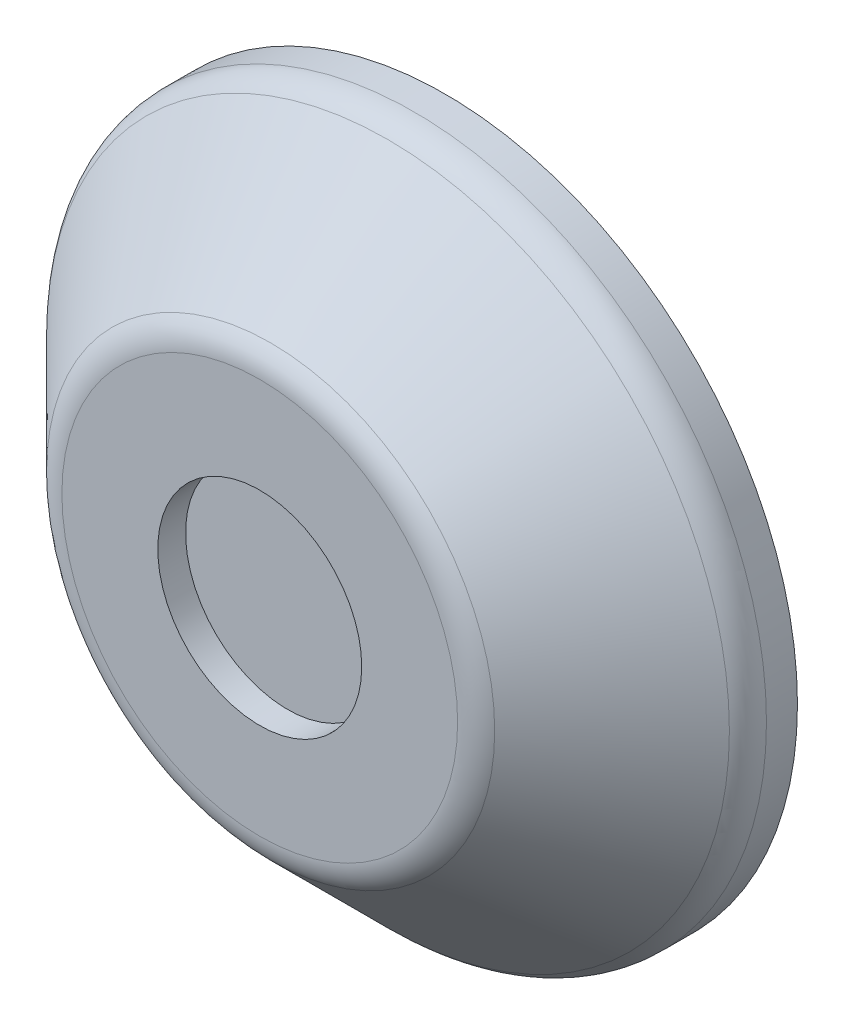
ISO-10303-21;
HEADER;
FILE_DESCRIPTION(('STEP AP214'),'2;1');
FILE_NAME('part.step','',(''),(''),'','','');
FILE_SCHEMA(('AUTOMOTIVE_DESIGN { 1 0 10303 214 1 1 1 1 }'));
ENDSEC;
DATA;
#1=APPLICATION_CONTEXT('core data for automotive mechanical design processes');
#2=APPLICATION_PROTOCOL_DEFINITION('international standard','automotive_design',2000,#1);
#3=PRODUCT_CONTEXT('',#1,'mechanical');
#4=PRODUCT('Part','Part','',(#3));
#5=PRODUCT_RELATED_PRODUCT_CATEGORY('part','',(#4));
#6=PRODUCT_DEFINITION_FORMATION('','',#4);
#7=PRODUCT_DEFINITION_CONTEXT('part definition',#1,'design');
#8=PRODUCT_DEFINITION('design','',#6,#7);
#9=PRODUCT_DEFINITION_SHAPE('','',#8);
#10=(LENGTH_UNIT() NAMED_UNIT(*) SI_UNIT(.MILLI.,.METRE.));
#11=(NAMED_UNIT(*) PLANE_ANGLE_UNIT() SI_UNIT($,.RADIAN.));
#12=(NAMED_UNIT(*) SI_UNIT($,.STERADIAN.) SOLID_ANGLE_UNIT());
#13=UNCERTAINTY_MEASURE_WITH_UNIT(LENGTH_MEASURE(1.E-05),#10,'distance_accuracy_value','');
#14=(GEOMETRIC_REPRESENTATION_CONTEXT(3) GLOBAL_UNCERTAINTY_ASSIGNED_CONTEXT((#13)) GLOBAL_UNIT_ASSIGNED_CONTEXT((#10,
#11,#12)) REPRESENTATION_CONTEXT('',''));
#15=CARTESIAN_POINT('',(0.,0.,0.));
#16=DIRECTION('',(0.,0.,1.));
#17=DIRECTION('',(1.,0.,0.));
#18=AXIS2_PLACEMENT_3D('',#15,#16,#17);
#19=CARTESIAN_POINT('',(-5.499999525,0.,-33.));
#20=DIRECTION('',(0.,0.,1.));
#21=DIRECTION('',(1.,0.,0.));
#22=AXIS2_PLACEMENT_3D('',#19,#20,#21);
#23=PLANE('',#22);
#24=CARTESIAN_POINT('',(0.,0.,-33.));
#25=DIRECTION('',(0.,0.,1.));
#26=DIRECTION('',(1.,0.,0.));
#27=AXIS2_PLACEMENT_3D('',#24,#25,#26);
#28=CIRCLE('',#27,10.99999905);
#29=CARTESIAN_POINT('',(10.99999905,0.,-33.));
#30=VERTEX_POINT('',#29);
#31=EDGE_CURVE('E163',#30,#30,#28,.T.);
#32=ORIENTED_EDGE('',*,*,#31,.T.);
#33=EDGE_LOOP('',(#32));
#34=FACE_BOUND('',#33,.T.);
#35=ADVANCED_FACE('F17',(#34),#23,.T.);
#36=CARTESIAN_POINT('',(0.,0.,-31.5));
#37=DIRECTION('',(0.,0.,1.));
#38=DIRECTION('',(1.,0.,0.));
#39=AXIS2_PLACEMENT_3D('',#36,#37,#38);
#40=CYLINDRICAL_SURFACE('',#39,10.99999905);
#41=CARTESIAN_POINT('',(0.,0.,-30.));
#42=DIRECTION('',(0.,0.,1.));
#43=DIRECTION('',(1.,0.,0.));
#44=AXIS2_PLACEMENT_3D('',#41,#42,#43);
#45=CIRCLE('',#44,10.99999905);
#46=CARTESIAN_POINT('',(10.99999905,0.,-30.));
#47=VERTEX_POINT('',#46);
#48=EDGE_CURVE('E41',#47,#47,#45,.F.);
#49=ORIENTED_EDGE('',*,*,#48,.F.);
#50=EDGE_LOOP('',(#49));
#51=FACE_BOUND('',#50,.T.);
#52=ORIENTED_EDGE('',*,*,#31,.F.);
#53=EDGE_LOOP('',(#52));
#54=FACE_BOUND('',#53,.T.);
#55=ADVANCED_FACE('F132',(#51,#54),#40,.F.);
#56=CARTESIAN_POINT('',(-16.1715724,0.,-30.0000000033561));
#57=DIRECTION('',(-6.48944115796926E-10,0.,1.));
#58=DIRECTION('',(1.,0.,6.48944115796926E-10));
#59=AXIS2_PLACEMENT_3D('',#56,#57,#58);
#60=PLANE('',#59);
#61=ORIENTED_EDGE('',*,*,#48,.T.);
#62=EDGE_LOOP('',(#61));
#63=FACE_BOUND('',#62,.T.);
#64=CARTESIAN_POINT('',(0.,0.,-30.0000000067121));
#65=DIRECTION('',(0.,0.,-1.));
#66=DIRECTION('',(-1.,0.,0.));
#67=AXIS2_PLACEMENT_3D('',#64,#65,#66);
#68=CIRCLE('',#67,21.34314575);
#69=CARTESIAN_POINT('',(-21.34314575,0.,-30.0000000067121));
#70=VERTEX_POINT('',#69);
#71=CARTESIAN_POINT('',(21.34314575,0.,-29.9999999956317));
#72=VERTEX_POINT('',#71);
#73=EDGE_CURVE('E34',#70,#72,#68,.T.);
#74=ORIENTED_EDGE('',*,*,#73,.F.);
#75=CARTESIAN_POINT('',(0.,0.,-30.0000000067121));
#76=DIRECTION('',(0.,0.,-1.));
#77=DIRECTION('',(1.,0.,0.));
#78=AXIS2_PLACEMENT_3D('',#75,#76,#77);
#79=CIRCLE('',#78,21.34314575);
#80=EDGE_CURVE('E39',#72,#70,#79,.T.);
#81=ORIENTED_EDGE('',*,*,#80,.F.);
#82=EDGE_LOOP('',(#74,#81));
#83=FACE_BOUND('',#82,.T.);
#84=ADVANCED_FACE('F38',(#63,#83),#60,.T.);
#85=CARTESIAN_POINT('',(0.,0.,-34.));
#86=DIRECTION('',(0.,0.,-1.));
#87=DIRECTION('',(-1.,0.,0.));
#88=AXIS2_PLACEMENT_3D('',#85,#86,#87);
#89=TOROIDAL_SURFACE('',#88,21.34314575,3.99999999328789);
#90=CARTESIAN_POINT('',(0.,0.,-31.1715728776269));
#91=DIRECTION('',(0.,0.,-1.));
#92=DIRECTION('',(-1.,0.,0.));
#93=AXIS2_PLACEMENT_3D('',#90,#91,#92);
#94=CIRCLE('',#93,24.1715728723731);
#95=CARTESIAN_POINT('',(-24.1715728723731,0.,-31.1715728776269));
#96=VERTEX_POINT('',#95);
#97=EDGE_CURVE('E46',#96,#96,#94,.T.);
#98=ORIENTED_EDGE('',*,*,#97,.F.);
#99=EDGE_LOOP('',(#98));
#100=FACE_BOUND('',#99,.T.);
#101=ORIENTED_EDGE('',*,*,#80,.T.);
#102=ORIENTED_EDGE('',*,*,#73,.T.);
#103=EDGE_LOOP('',(#101,#102));
#104=FACE_BOUND('',#103,.T.);
#105=ADVANCED_FACE('F45',(#100,#104),#89,.T.);
#106=CARTESIAN_POINT('',(0.,0.,-43.8284271276269));
#107=DIRECTION('',(0.,0.,-1.));
#108=DIRECTION('',(-1.,0.,0.));
#109=AXIS2_PLACEMENT_3D('',#106,#107,#108);
#110=CONICAL_SURFACE('',#109,36.8284271223731,0.785398163397448);
#111=CARTESIAN_POINT('',(0.,0.,-43.8284271252538));
#112=DIRECTION('',(0.,0.,-1.));
#113=DIRECTION('',(-1.,0.,0.));
#114=AXIS2_PLACEMENT_3D('',#111,#112,#113);
#115=CIRCLE('',#114,36.8284271247462);
#116=CARTESIAN_POINT('',(-36.8284271247462,0.,-43.8284271252538));
#117=VERTEX_POINT('',#116);
#118=EDGE_CURVE('E71',#117,#117,#115,.T.);
#119=ORIENTED_EDGE('',*,*,#118,.F.);
#120=EDGE_LOOP('',(#119));
#121=FACE_BOUND('',#120,.T.);
#122=ORIENTED_EDGE('',*,*,#97,.T.);
#123=EDGE_LOOP('',(#122));
#124=FACE_BOUND('',#123,.T.);
#125=ADVANCED_FACE('F64',(#121,#124),#110,.T.);
#126=CARTESIAN_POINT('',(0.,0.,-46.65685425));
#127=DIRECTION('',(0.,0.,-1.));
#128=DIRECTION('',(-1.,0.,0.));
#129=AXIS2_PLACEMENT_3D('',#126,#127,#128);
#130=TOROIDAL_SURFACE('',#129,34.,4.00000000000006);
#131=CARTESIAN_POINT('',(0.,0.,-46.65685425));
#132=DIRECTION('',(0.,0.,1.));
#133=DIRECTION('',(1.,0.,0.));
#134=AXIS2_PLACEMENT_3D('',#131,#132,#133);
#135=CIRCLE('',#134,38.);
#136=CARTESIAN_POINT('',(38.,0.,-46.65685425));
#137=VERTEX_POINT('',#136);
#138=EDGE_CURVE('E28',#137,#137,#135,.F.);
#139=ORIENTED_EDGE('',*,*,#138,.F.);
#140=EDGE_LOOP('',(#139));
#141=FACE_BOUND('',#140,.T.);
#142=ORIENTED_EDGE('',*,*,#118,.T.);
#143=EDGE_LOOP('',(#142));
#144=FACE_BOUND('',#143,.T.);
#145=ADVANCED_FACE('F84',(#141,#144),#130,.T.);
#146=CARTESIAN_POINT('',(0.,0.,-48.328427125));
#147=DIRECTION('',(0.,0.,1.));
#148=DIRECTION('',(1.,0.,0.));
#149=AXIS2_PLACEMENT_3D('',#146,#147,#148);
#150=CYLINDRICAL_SURFACE('',#149,38.);
#151=CARTESIAN_POINT('',(0.,0.,-50.));
#152=DIRECTION('',(0.,0.,1.));
#153=DIRECTION('',(1.,0.,0.));
#154=AXIS2_PLACEMENT_3D('',#151,#152,#153);
#155=CIRCLE('',#154,38.);
#156=CARTESIAN_POINT('',(38.,0.,-50.));
#157=VERTEX_POINT('',#156);
#158=EDGE_CURVE('E11',#157,#157,#155,.F.);
#159=ORIENTED_EDGE('',*,*,#158,.F.);
#160=EDGE_LOOP('',(#159));
#161=FACE_BOUND('',#160,.T.);
#162=ORIENTED_EDGE('',*,*,#138,.T.);
#163=EDGE_LOOP('',(#162));
#164=FACE_BOUND('',#163,.T.);
#165=ADVANCED_FACE('F87',(#161,#164),#150,.T.);
#166=CARTESIAN_POINT('',(-19.,0.,-50.));
#167=DIRECTION('',(0.,0.,-1.));
#168=DIRECTION('',(-1.,0.,0.));
#169=AXIS2_PLACEMENT_3D('',#166,#167,#168);
#170=PLANE('',#169);
#171=ORIENTED_EDGE('',*,*,#158,.T.);
#172=EDGE_LOOP('',(#171));
#173=FACE_BOUND('',#172,.T.);
#174=ADVANCED_FACE('F91',(#173),#170,.T.);
#175=CLOSED_SHELL('',(#35,#55,#84,#105,#125,#145,#165,#174));
#176=MANIFOLD_SOLID_BREP('B1',#175);
#177=ADVANCED_BREP_SHAPE_REPRESENTATION('',(#18,#176),#14);
#178=SHAPE_DEFINITION_REPRESENTATION(#9,#177);
ENDSEC;
END-ISO-10303-21;
